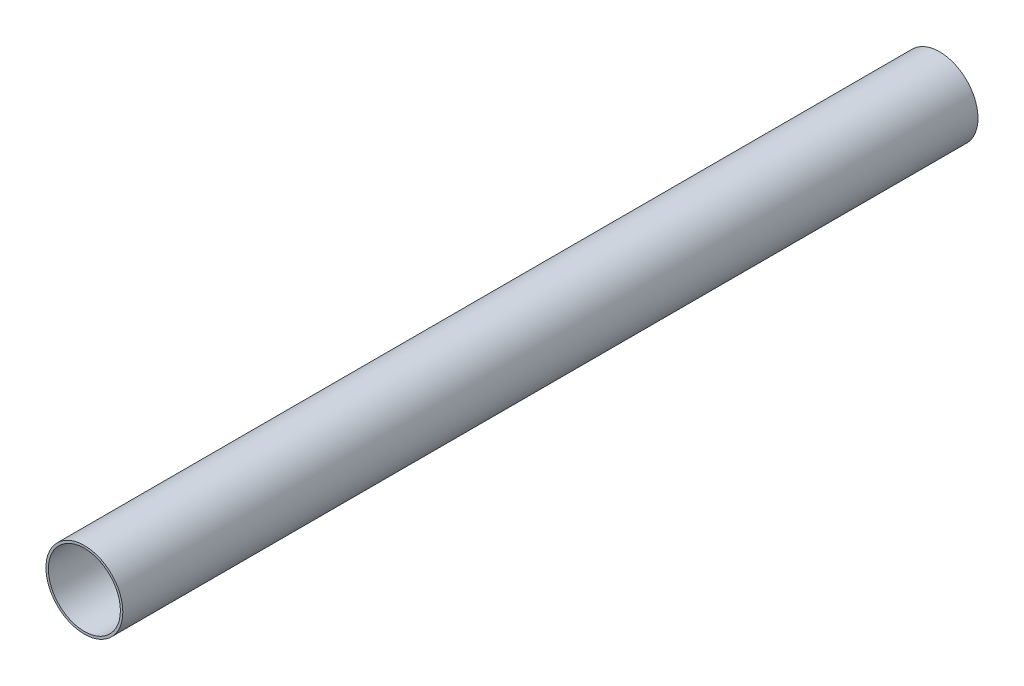
ISO-10303-21;
HEADER;
FILE_DESCRIPTION(('STEP AP214'),'2;1');
FILE_NAME('part.step','',(''),(''),'','','');
FILE_SCHEMA(('AUTOMOTIVE_DESIGN { 1 0 10303 214 1 1 1 1 }'));
ENDSEC;
DATA;
#1=APPLICATION_CONTEXT('core data for automotive mechanical design processes');
#2=APPLICATION_PROTOCOL_DEFINITION('international standard','automotive_design',2000,#1);
#3=PRODUCT_CONTEXT('',#1,'mechanical');
#4=PRODUCT('Part','Part','',(#3));
#5=PRODUCT_RELATED_PRODUCT_CATEGORY('part','',(#4));
#6=PRODUCT_DEFINITION_FORMATION('','',#4);
#7=PRODUCT_DEFINITION_CONTEXT('part definition',#1,'design');
#8=PRODUCT_DEFINITION('design','',#6,#7);
#9=PRODUCT_DEFINITION_SHAPE('','',#8);
#10=(LENGTH_UNIT() NAMED_UNIT(*) SI_UNIT(.MILLI.,.METRE.));
#11=(NAMED_UNIT(*) PLANE_ANGLE_UNIT() SI_UNIT($,.RADIAN.));
#12=(NAMED_UNIT(*) SI_UNIT($,.STERADIAN.) SOLID_ANGLE_UNIT());
#13=UNCERTAINTY_MEASURE_WITH_UNIT(LENGTH_MEASURE(1.E-05),#10,'distance_accuracy_value','');
#14=(GEOMETRIC_REPRESENTATION_CONTEXT(3) GLOBAL_UNCERTAINTY_ASSIGNED_CONTEXT((#13)) GLOBAL_UNIT_ASSIGNED_CONTEXT((#10,
#11,#12)) REPRESENTATION_CONTEXT('',''));
#15=CARTESIAN_POINT('',(0.,0.,0.));
#16=DIRECTION('',(0.,0.,1.));
#17=DIRECTION('',(1.,0.,0.));
#18=AXIS2_PLACEMENT_3D('',#15,#16,#17);
#19=CARTESIAN_POINT('',(0.,0.,282.606506287));
#20=DIRECTION('',(0.,0.,1.));
#21=DIRECTION('',(1.,0.,0.));
#22=AXIS2_PLACEMENT_3D('',#19,#20,#21);
#23=PLANE('',#22);
#24=CARTESIAN_POINT('',(0.,0.,282.606506287));
#25=DIRECTION('',(0.,0.,1.));
#26=DIRECTION('',(1.,0.,0.));
#27=AXIS2_PLACEMENT_3D('',#24,#25,#26);
#28=CIRCLE('',#27,25.4);
#29=CARTESIAN_POINT('',(25.4,0.,282.606506287));
#30=VERTEX_POINT('',#29);
#31=EDGE_CURVE('E10',#30,#30,#28,.T.);
#32=ORIENTED_EDGE('',*,*,#31,.T.);
#33=EDGE_LOOP('',(#32));
#34=FACE_BOUND('',#33,.T.);
#35=CARTESIAN_POINT('',(0.,0.,282.606506287));
#36=DIRECTION('',(0.,0.,1.));
#37=DIRECTION('',(1.,0.,0.));
#38=AXIS2_PLACEMENT_3D('',#35,#36,#37);
#39=CIRCLE('',#38,23.8125);
#40=CARTESIAN_POINT('',(23.8125,0.,282.606506287));
#41=VERTEX_POINT('',#40);
#42=EDGE_CURVE('E48',#41,#41,#39,.T.);
#43=ORIENTED_EDGE('',*,*,#42,.F.);
#44=EDGE_LOOP('',(#43));
#45=FACE_BOUND('',#44,.T.);
#46=ADVANCED_FACE('F37',(#34,#45),#23,.T.);
#47=CARTESIAN_POINT('',(0.,0.,-282.606506287));
#48=DIRECTION('',(0.,0.,1.));
#49=DIRECTION('',(1.,0.,0.));
#50=AXIS2_PLACEMENT_3D('',#47,#48,#49);
#51=PLANE('',#50);
#52=CARTESIAN_POINT('',(0.,0.,-282.606506287));
#53=DIRECTION('',(0.,0.,1.));
#54=DIRECTION('',(1.,0.,0.));
#55=AXIS2_PLACEMENT_3D('',#52,#53,#54);
#56=CIRCLE('',#55,25.4);
#57=CARTESIAN_POINT('',(25.4,0.,-282.606506287));
#58=VERTEX_POINT('',#57);
#59=EDGE_CURVE('E41',#58,#58,#56,.T.);
#60=ORIENTED_EDGE('',*,*,#59,.F.);
#61=EDGE_LOOP('',(#60));
#62=FACE_BOUND('',#61,.T.);
#63=CARTESIAN_POINT('',(0.,0.,-282.606506287));
#64=DIRECTION('',(0.,0.,1.));
#65=DIRECTION('',(1.,0.,0.));
#66=AXIS2_PLACEMENT_3D('',#63,#64,#65);
#67=CIRCLE('',#66,23.8125);
#68=CARTESIAN_POINT('',(23.8125,0.,-282.606506287));
#69=VERTEX_POINT('',#68);
#70=EDGE_CURVE('E50',#69,#69,#67,.T.);
#71=ORIENTED_EDGE('',*,*,#70,.T.);
#72=EDGE_LOOP('',(#71));
#73=FACE_BOUND('',#72,.T.);
#74=ADVANCED_FACE('F60',(#62,#73),#51,.F.);
#75=CARTESIAN_POINT('',(0.,0.,282.606506287));
#76=DIRECTION('',(0.,0.,-1.));
#77=DIRECTION('',(-1.,0.,0.));
#78=AXIS2_PLACEMENT_3D('',#75,#76,#77);
#79=CYLINDRICAL_SURFACE('',#78,25.4);
#80=ORIENTED_EDGE('',*,*,#31,.F.);
#81=EDGE_LOOP('',(#80));
#82=FACE_BOUND('',#81,.T.);
#83=ORIENTED_EDGE('',*,*,#59,.T.);
#84=EDGE_LOOP('',(#83));
#85=FACE_BOUND('',#84,.T.);
#86=ADVANCED_FACE('F39',(#82,#85),#79,.T.);
#87=CARTESIAN_POINT('',(0.,0.,282.606506287));
#88=DIRECTION('',(0.,0.,-1.));
#89=DIRECTION('',(-1.,0.,0.));
#90=AXIS2_PLACEMENT_3D('',#87,#88,#89);
#91=CYLINDRICAL_SURFACE('',#90,23.8125);
#92=ORIENTED_EDGE('',*,*,#42,.T.);
#93=EDGE_LOOP('',(#92));
#94=FACE_BOUND('',#93,.T.);
#95=ORIENTED_EDGE('',*,*,#70,.F.);
#96=EDGE_LOOP('',(#95));
#97=FACE_BOUND('',#96,.T.);
#98=ADVANCED_FACE('F56',(#94,#97),#91,.F.);
#99=CLOSED_SHELL('',(#46,#74,#86,#98));
#100=MANIFOLD_SOLID_BREP('B2',#99);
#101=ADVANCED_BREP_SHAPE_REPRESENTATION('',(#18,#100),#14);
#102=SHAPE_DEFINITION_REPRESENTATION(#9,#101);
ENDSEC;
END-ISO-10303-21;
